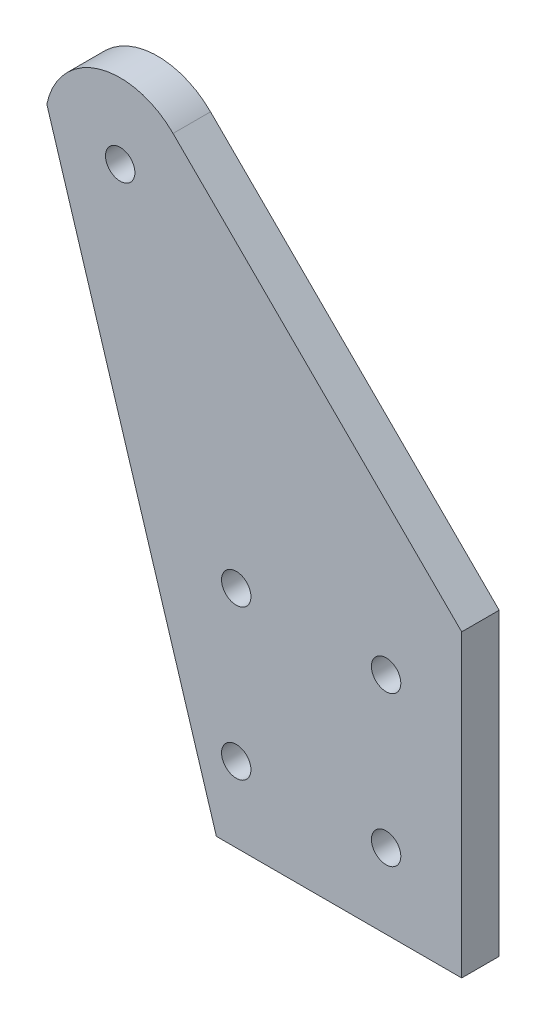
ISO-10303-21;
HEADER;
FILE_DESCRIPTION(('STEP AP214'),'2;1');
FILE_NAME('part.step','',(''),(''),'','','');
FILE_SCHEMA(('AUTOMOTIVE_DESIGN { 1 0 10303 214 1 1 1 1 }'));
ENDSEC;
DATA;
#1=APPLICATION_CONTEXT('core data for automotive mechanical design processes');
#2=APPLICATION_PROTOCOL_DEFINITION('international standard','automotive_design',2000,#1);
#3=PRODUCT_CONTEXT('',#1,'mechanical');
#4=PRODUCT('Part','Part','',(#3));
#5=PRODUCT_RELATED_PRODUCT_CATEGORY('part','',(#4));
#6=PRODUCT_DEFINITION_FORMATION('','',#4);
#7=PRODUCT_DEFINITION_CONTEXT('part definition',#1,'design');
#8=PRODUCT_DEFINITION('design','',#6,#7);
#9=PRODUCT_DEFINITION_SHAPE('','',#8);
#10=(LENGTH_UNIT() NAMED_UNIT(*) SI_UNIT(.MILLI.,.METRE.));
#11=(NAMED_UNIT(*) PLANE_ANGLE_UNIT() SI_UNIT($,.RADIAN.));
#12=(NAMED_UNIT(*) SI_UNIT($,.STERADIAN.) SOLID_ANGLE_UNIT());
#13=UNCERTAINTY_MEASURE_WITH_UNIT(LENGTH_MEASURE(1.E-05),#10,'distance_accuracy_value','');
#14=(GEOMETRIC_REPRESENTATION_CONTEXT(3) GLOBAL_UNCERTAINTY_ASSIGNED_CONTEXT((#13)) GLOBAL_UNIT_ASSIGNED_CONTEXT((#10,
#11,#12)) REPRESENTATION_CONTEXT('',''));
#15=CARTESIAN_POINT('',(0.,0.,0.));
#16=DIRECTION('',(0.,0.,1.));
#17=DIRECTION('',(1.,0.,0.));
#18=AXIS2_PLACEMENT_3D('',#15,#16,#17);
#19=CARTESIAN_POINT('',(559.488248924119,155.333748981181,3.175));
#20=DIRECTION('',(0.,0.,-1.));
#21=DIRECTION('',(-1.,0.,0.));
#22=AXIS2_PLACEMENT_3D('',#19,#20,#21);
#23=CYLINDRICAL_SURFACE('',#22,12.7);
#24=CARTESIAN_POINT('',(559.488248924119,155.333748981181,-3.175));
#25=DIRECTION('',(0.,0.,1.));
#26=DIRECTION('',(1.,0.,0.));
#27=AXIS2_PLACEMENT_3D('',#24,#25,#26);
#28=CIRCLE('',#27,12.7);
#29=CARTESIAN_POINT('',(568.447904306028,164.334558691281,-3.175));
#30=VERTEX_POINT('',#29);
#31=CARTESIAN_POINT('',(547.056708923535,157.931211822858,-3.175));
#32=VERTEX_POINT('',#31);
#33=EDGE_CURVE('E148',#30,#32,#28,.T.);
#34=ORIENTED_EDGE('',*,*,#33,.T.);
#35=DIRECTION('',(0.,0.,-1.));
#36=VECTOR('',#35,1.);
#37=CARTESIAN_POINT('',(547.056708923535,157.931211822858,3.175));
#38=LINE('',#37,#36);
#39=CARTESIAN_POINT('',(547.056708923535,157.931211822858,3.175));
#40=VERTEX_POINT('',#39);
#41=EDGE_CURVE('E11',#40,#32,#38,.T.);
#42=ORIENTED_EDGE('',*,*,#41,.F.);
#43=CARTESIAN_POINT('',(559.488248924119,155.333748981181,3.175));
#44=DIRECTION('',(0.,0.,1.));
#45=DIRECTION('',(1.,0.,0.));
#46=AXIS2_PLACEMENT_3D('',#43,#44,#45);
#47=CIRCLE('',#46,12.7);
#48=CARTESIAN_POINT('',(568.447904306028,164.334558691281,3.175));
#49=VERTEX_POINT('',#48);
#50=EDGE_CURVE('E183',#49,#40,#47,.T.);
#51=ORIENTED_EDGE('',*,*,#50,.F.);
#52=DIRECTION('',(0.,0.,-1.));
#53=VECTOR('',#52,1.);
#54=CARTESIAN_POINT('',(568.447904306028,164.334558691281,3.175));
#55=LINE('',#54,#53);
#56=EDGE_CURVE('E64',#49,#30,#55,.T.);
#57=ORIENTED_EDGE('',*,*,#56,.T.);
#58=EDGE_LOOP('',(#34,#42,#51,#57));
#59=FACE_BOUND('',#58,.T.);
#60=ADVANCED_FACE('F47',(#59),#23,.T.);
#61=CARTESIAN_POINT('',(543.978434693979,167.904246073688,3.175));
#62=DIRECTION('',(0.955518802483172,0.29493019191179,0.));
#63=DIRECTION('',(-0.29493019191179,0.955518802483172,0.));
#64=AXIS2_PLACEMENT_3D('',#61,#62,#63);
#65=PLANE('',#64);
#66=DIRECTION('',(0.29493019191179,-0.955518802483172,0.));
#67=VECTOR('',#66,1.);
#68=CARTESIAN_POINT('',(543.978434693979,167.904246073688,-3.175));
#69=LINE('',#68,#67);
#70=CARTESIAN_POINT('',(575.788290011895,64.8462489811812,-3.175));
#71=VERTEX_POINT('',#70);
#72=EDGE_CURVE('E151',#32,#71,#69,.T.);
#73=ORIENTED_EDGE('',*,*,#72,.T.);
#74=DIRECTION('',(0.,0.,-1.));
#75=VECTOR('',#74,1.);
#76=CARTESIAN_POINT('',(575.788290011895,64.8462489811812,3.175));
#77=LINE('',#76,#75);
#78=CARTESIAN_POINT('',(575.788290011895,64.8462489811812,3.175));
#79=VERTEX_POINT('',#78);
#80=EDGE_CURVE('E56',#79,#71,#77,.T.);
#81=ORIENTED_EDGE('',*,*,#80,.F.);
#82=DIRECTION('',(0.29493019191179,-0.955518802483172,0.));
#83=VECTOR('',#82,1.);
#84=CARTESIAN_POINT('',(543.978434693979,167.904246073688,3.175));
#85=LINE('',#84,#83);
#86=EDGE_CURVE('E93',#40,#79,#85,.T.);
#87=ORIENTED_EDGE('',*,*,#86,.F.);
#88=ORIENTED_EDGE('',*,*,#41,.T.);
#89=EDGE_LOOP('',(#73,#81,#87,#88));
#90=FACE_BOUND('',#89,.T.);
#91=ADVANCED_FACE('F207',(#90),#65,.F.);
#92=CARTESIAN_POINT('',(0.,64.8462489811812,3.175));
#93=DIRECTION('',(0.,1.,0.));
#94=DIRECTION('',(0.,0.,1.));
#95=AXIS2_PLACEMENT_3D('',#92,#93,#94);
#96=PLANE('',#95);
#97=DIRECTION('',(1.,0.,0.));
#98=VECTOR('',#97,1.);
#99=CARTESIAN_POINT('',(0.,64.8462489811812,-3.175));
#100=LINE('',#99,#98);
#101=CARTESIAN_POINT('',(617.35985372005,64.8462489811812,-3.175));
#102=VERTEX_POINT('',#101);
#103=EDGE_CURVE('E115',#71,#102,#100,.T.);
#104=ORIENTED_EDGE('',*,*,#103,.T.);
#105=DIRECTION('',(0.,0.,-1.));
#106=VECTOR('',#105,1.);
#107=CARTESIAN_POINT('',(617.35985372005,64.8462489811812,3.175));
#108=LINE('',#107,#106);
#109=CARTESIAN_POINT('',(617.35985372005,64.8462489811812,3.175));
#110=VERTEX_POINT('',#109);
#111=EDGE_CURVE('E112',#110,#102,#108,.T.);
#112=ORIENTED_EDGE('',*,*,#111,.F.);
#113=DIRECTION('',(1.,0.,0.));
#114=VECTOR('',#113,1.);
#115=CARTESIAN_POINT('',(0.,64.8462489811812,3.175));
#116=LINE('',#115,#114);
#117=EDGE_CURVE('E100',#79,#110,#116,.T.);
#118=ORIENTED_EDGE('',*,*,#117,.F.);
#119=ORIENTED_EDGE('',*,*,#80,.T.);
#120=EDGE_LOOP('',(#104,#112,#118,#119));
#121=FACE_BOUND('',#120,.T.);
#122=ADVANCED_FACE('F113',(#121),#96,.F.);
#123=CARTESIAN_POINT('',(617.35985372005,0.,3.175));
#124=DIRECTION('',(1.,0.,0.));
#125=DIRECTION('',(0.,0.,-1.));
#126=AXIS2_PLACEMENT_3D('',#123,#124,#125);
#127=PLANE('',#126);
#128=DIRECTION('',(0.,-1.,0.));
#129=VECTOR('',#128,1.);
#130=CARTESIAN_POINT('',(617.35985372005,0.,-3.175));
#131=LINE('',#130,#129);
#132=CARTESIAN_POINT('',(617.35985372005,115.646248981181,-3.175));
#133=VERTEX_POINT('',#132);
#134=EDGE_CURVE('E156',#133,#102,#131,.T.);
#135=ORIENTED_EDGE('',*,*,#134,.F.);
#136=DIRECTION('',(0.,0.,-1.));
#137=VECTOR('',#136,1.);
#138=CARTESIAN_POINT('',(617.35985372005,115.646248981181,3.175));
#139=LINE('',#138,#137);
#140=CARTESIAN_POINT('',(617.35985372005,115.646248981181,3.175));
#141=VERTEX_POINT('',#140);
#142=EDGE_CURVE('E81',#141,#133,#139,.T.);
#143=ORIENTED_EDGE('',*,*,#142,.F.);
#144=DIRECTION('',(0.,-1.,0.));
#145=VECTOR('',#144,1.);
#146=CARTESIAN_POINT('',(617.35985372005,0.,3.175));
#147=LINE('',#146,#145);
#148=EDGE_CURVE('E106',#141,#110,#147,.T.);
#149=ORIENTED_EDGE('',*,*,#148,.T.);
#150=ORIENTED_EDGE('',*,*,#111,.T.);
#151=EDGE_LOOP('',(#135,#143,#149,#150));
#152=FACE_BOUND('',#151,.T.);
#153=ADVANCED_FACE('F120',(#152),#127,.T.);
#154=CARTESIAN_POINT('',(579.152741561414,77.5462489811812,3.175));
#155=DIRECTION('',(0.,0.,-1.));
#156=DIRECTION('',(-1.,0.,0.));
#157=AXIS2_PLACEMENT_3D('',#154,#155,#156);
#158=CYLINDRICAL_SURFACE('',#157,2.48920000000006);
#159=CARTESIAN_POINT('',(579.152741561414,77.5462489811812,3.175));
#160=DIRECTION('',(0.,0.,1.));
#161=DIRECTION('',(1.,0.,0.));
#162=AXIS2_PLACEMENT_3D('',#159,#160,#161);
#163=CIRCLE('',#162,2.48920000000006);
#164=CARTESIAN_POINT('',(581.641941561414,77.5462489811812,3.175));
#165=VERTEX_POINT('',#164);
#166=EDGE_CURVE('E140',#165,#165,#163,.T.);
#167=ORIENTED_EDGE('',*,*,#166,.T.);
#168=EDGE_LOOP('',(#167));
#169=FACE_BOUND('',#168,.T.);
#170=CARTESIAN_POINT('',(579.152741561414,77.5462489811812,-3.175));
#171=DIRECTION('',(0.,0.,1.));
#172=DIRECTION('',(1.,0.,0.));
#173=AXIS2_PLACEMENT_3D('',#170,#171,#172);
#174=CIRCLE('',#173,2.48920000000006);
#175=CARTESIAN_POINT('',(581.641941561414,77.5462489811812,-3.175));
#176=VERTEX_POINT('',#175);
#177=EDGE_CURVE('E175',#176,#176,#174,.T.);
#178=ORIENTED_EDGE('',*,*,#177,.F.);
#179=EDGE_LOOP('',(#178));
#180=FACE_BOUND('',#179,.T.);
#181=ADVANCED_FACE('F220',(#169,#180),#158,.F.);
#182=CARTESIAN_POINT('',(604.552741561414,77.5462489811812,3.175));
#183=DIRECTION('',(0.,0.,-1.));
#184=DIRECTION('',(-1.,0.,0.));
#185=AXIS2_PLACEMENT_3D('',#182,#183,#184);
#186=CYLINDRICAL_SURFACE('',#185,2.48920000000006);
#187=CARTESIAN_POINT('',(604.552741561414,77.5462489811812,3.175));
#188=DIRECTION('',(0.,0.,1.));
#189=DIRECTION('',(1.,0.,0.));
#190=AXIS2_PLACEMENT_3D('',#187,#188,#189);
#191=CIRCLE('',#190,2.48920000000006);
#192=CARTESIAN_POINT('',(607.041941561414,77.5462489811812,3.175));
#193=VERTEX_POINT('',#192);
#194=EDGE_CURVE('E136',#193,#193,#191,.T.);
#195=ORIENTED_EDGE('',*,*,#194,.T.);
#196=EDGE_LOOP('',(#195));
#197=FACE_BOUND('',#196,.T.);
#198=CARTESIAN_POINT('',(604.552741561414,77.5462489811812,-3.175));
#199=DIRECTION('',(0.,0.,1.));
#200=DIRECTION('',(1.,0.,0.));
#201=AXIS2_PLACEMENT_3D('',#198,#199,#200);
#202=CIRCLE('',#201,2.48920000000006);
#203=CARTESIAN_POINT('',(607.041941561414,77.5462489811812,-3.175));
#204=VERTEX_POINT('',#203);
#205=EDGE_CURVE('E171',#204,#204,#202,.T.);
#206=ORIENTED_EDGE('',*,*,#205,.F.);
#207=EDGE_LOOP('',(#206));
#208=FACE_BOUND('',#207,.T.);
#209=ADVANCED_FACE('F224',(#197,#208),#186,.F.);
#210=CARTESIAN_POINT('',(604.552741561414,102.946248981181,3.175));
#211=DIRECTION('',(0.,0.,-1.));
#212=DIRECTION('',(-1.,0.,0.));
#213=AXIS2_PLACEMENT_3D('',#210,#211,#212);
#214=CYLINDRICAL_SURFACE('',#213,2.48920000000006);
#215=CARTESIAN_POINT('',(604.552741561414,102.946248981181,3.175));
#216=DIRECTION('',(0.,0.,1.));
#217=DIRECTION('',(1.,0.,0.));
#218=AXIS2_PLACEMENT_3D('',#215,#216,#217);
#219=CIRCLE('',#218,2.48920000000006);
#220=CARTESIAN_POINT('',(607.041941561414,102.946248981181,3.175));
#221=VERTEX_POINT('',#220);
#222=EDGE_CURVE('E132',#221,#221,#219,.T.);
#223=ORIENTED_EDGE('',*,*,#222,.T.);
#224=EDGE_LOOP('',(#223));
#225=FACE_BOUND('',#224,.T.);
#226=CARTESIAN_POINT('',(604.552741561414,102.946248981181,-3.175));
#227=DIRECTION('',(0.,0.,1.));
#228=DIRECTION('',(1.,0.,0.));
#229=AXIS2_PLACEMENT_3D('',#226,#227,#228);
#230=CIRCLE('',#229,2.48920000000006);
#231=CARTESIAN_POINT('',(607.041941561414,102.946248981181,-3.175));
#232=VERTEX_POINT('',#231);
#233=EDGE_CURVE('E167',#232,#232,#230,.T.);
#234=ORIENTED_EDGE('',*,*,#233,.F.);
#235=EDGE_LOOP('',(#234));
#236=FACE_BOUND('',#235,.T.);
#237=ADVANCED_FACE('F202',(#225,#236),#214,.F.);
#238=CARTESIAN_POINT('',(579.152741561414,102.946248981181,3.175));
#239=DIRECTION('',(0.,0.,-1.));
#240=DIRECTION('',(-1.,0.,0.));
#241=AXIS2_PLACEMENT_3D('',#238,#239,#240);
#242=CYLINDRICAL_SURFACE('',#241,2.48920000000006);
#243=CARTESIAN_POINT('',(579.152741561414,102.946248981181,3.175));
#244=DIRECTION('',(0.,0.,1.));
#245=DIRECTION('',(1.,0.,0.));
#246=AXIS2_PLACEMENT_3D('',#243,#244,#245);
#247=CIRCLE('',#246,2.48920000000006);
#248=CARTESIAN_POINT('',(581.641941561414,102.946248981181,3.175));
#249=VERTEX_POINT('',#248);
#250=EDGE_CURVE('E125',#249,#249,#247,.T.);
#251=ORIENTED_EDGE('',*,*,#250,.T.);
#252=EDGE_LOOP('',(#251));
#253=FACE_BOUND('',#252,.T.);
#254=CARTESIAN_POINT('',(579.152741561414,102.946248981181,-3.175));
#255=DIRECTION('',(0.,0.,1.));
#256=DIRECTION('',(1.,0.,0.));
#257=AXIS2_PLACEMENT_3D('',#254,#255,#256);
#258=CIRCLE('',#257,2.48920000000006);
#259=CARTESIAN_POINT('',(581.641941561414,102.946248981181,-3.175));
#260=VERTEX_POINT('',#259);
#261=EDGE_CURVE('E163',#260,#260,#258,.T.);
#262=ORIENTED_EDGE('',*,*,#261,.F.);
#263=EDGE_LOOP('',(#262));
#264=FACE_BOUND('',#263,.T.);
#265=ADVANCED_FACE('F194',(#253,#264),#242,.F.);
#266=CARTESIAN_POINT('',(365.087842895137,366.764798566363,3.175));
#267=DIRECTION('',(0.705484675740877,0.708725174023605,0.));
#268=DIRECTION('',(-0.708725174023605,0.705484675740877,0.));
#269=AXIS2_PLACEMENT_3D('',#266,#267,#268);
#270=PLANE('',#269);
#271=DIRECTION('',(0.708725174023605,-0.705484675740877,0.));
#272=VECTOR('',#271,1.);
#273=CARTESIAN_POINT('',(365.087842895137,366.764798566363,-3.175));
#274=LINE('',#273,#272);
#275=EDGE_CURVE('E159',#30,#133,#274,.T.);
#276=ORIENTED_EDGE('',*,*,#275,.F.);
#277=ORIENTED_EDGE('',*,*,#56,.F.);
#278=DIRECTION('',(0.708725174023605,-0.705484675740877,0.));
#279=VECTOR('',#278,1.);
#280=CARTESIAN_POINT('',(365.087842895137,366.764798566363,3.175));
#281=LINE('',#280,#279);
#282=EDGE_CURVE('E122',#49,#141,#281,.T.);
#283=ORIENTED_EDGE('',*,*,#282,.T.);
#284=ORIENTED_EDGE('',*,*,#142,.T.);
#285=EDGE_LOOP('',(#276,#277,#283,#284));
#286=FACE_BOUND('',#285,.T.);
#287=ADVANCED_FACE('F191',(#286),#270,.T.);
#288=CARTESIAN_POINT('',(559.488248924119,155.333748981181,3.175));
#289=DIRECTION('',(0.,0.,-1.));
#290=DIRECTION('',(-1.,0.,0.));
#291=AXIS2_PLACEMENT_3D('',#288,#289,#290);
#292=CYLINDRICAL_SURFACE('',#291,2.48919999999995);
#293=CARTESIAN_POINT('',(559.488248924119,155.333748981181,3.175));
#294=DIRECTION('',(0.,0.,1.));
#295=DIRECTION('',(1.,0.,0.));
#296=AXIS2_PLACEMENT_3D('',#293,#294,#295);
#297=CIRCLE('',#296,2.48919999999995);
#298=CARTESIAN_POINT('',(561.977448924119,155.333748981181,3.175));
#299=VERTEX_POINT('',#298);
#300=EDGE_CURVE('E144',#299,#299,#297,.T.);
#301=ORIENTED_EDGE('',*,*,#300,.T.);
#302=EDGE_LOOP('',(#301));
#303=FACE_BOUND('',#302,.T.);
#304=CARTESIAN_POINT('',(559.488248924119,155.333748981181,-3.175));
#305=DIRECTION('',(0.,0.,1.));
#306=DIRECTION('',(1.,0.,0.));
#307=AXIS2_PLACEMENT_3D('',#304,#305,#306);
#308=CIRCLE('',#307,2.48919999999995);
#309=CARTESIAN_POINT('',(561.977448924119,155.333748981181,-3.175));
#310=VERTEX_POINT('',#309);
#311=EDGE_CURVE('E179',#310,#310,#308,.T.);
#312=ORIENTED_EDGE('',*,*,#311,.F.);
#313=EDGE_LOOP('',(#312));
#314=FACE_BOUND('',#313,.T.);
#315=ADVANCED_FACE('F193',(#303,#314),#292,.F.);
#316=CARTESIAN_POINT('',(0.,0.,3.175));
#317=DIRECTION('',(0.,0.,1.));
#318=DIRECTION('',(1.,0.,0.));
#319=AXIS2_PLACEMENT_3D('',#316,#317,#318);
#320=PLANE('',#319);
#321=ORIENTED_EDGE('',*,*,#50,.T.);
#322=ORIENTED_EDGE('',*,*,#86,.T.);
#323=ORIENTED_EDGE('',*,*,#117,.T.);
#324=ORIENTED_EDGE('',*,*,#148,.F.);
#325=ORIENTED_EDGE('',*,*,#282,.F.);
#326=EDGE_LOOP('',(#321,#322,#323,#324,#325));
#327=FACE_BOUND('',#326,.T.);
#328=ORIENTED_EDGE('',*,*,#250,.F.);
#329=EDGE_LOOP('',(#328));
#330=FACE_BOUND('',#329,.T.);
#331=ORIENTED_EDGE('',*,*,#222,.F.);
#332=EDGE_LOOP('',(#331));
#333=FACE_BOUND('',#332,.T.);
#334=ORIENTED_EDGE('',*,*,#194,.F.);
#335=EDGE_LOOP('',(#334));
#336=FACE_BOUND('',#335,.T.);
#337=ORIENTED_EDGE('',*,*,#166,.F.);
#338=EDGE_LOOP('',(#337));
#339=FACE_BOUND('',#338,.T.);
#340=ORIENTED_EDGE('',*,*,#300,.F.);
#341=EDGE_LOOP('',(#340));
#342=FACE_BOUND('',#341,.T.);
#343=ADVANCED_FACE('F102',(#327,#330,#333,#336,#339,#342),#320,.T.);
#344=CARTESIAN_POINT('',(0.,0.,-3.175));
#345=DIRECTION('',(0.,0.,1.));
#346=DIRECTION('',(1.,0.,0.));
#347=AXIS2_PLACEMENT_3D('',#344,#345,#346);
#348=PLANE('',#347);
#349=ORIENTED_EDGE('',*,*,#33,.F.);
#350=ORIENTED_EDGE('',*,*,#275,.T.);
#351=ORIENTED_EDGE('',*,*,#134,.T.);
#352=ORIENTED_EDGE('',*,*,#103,.F.);
#353=ORIENTED_EDGE('',*,*,#72,.F.);
#354=EDGE_LOOP('',(#349,#350,#351,#352,#353));
#355=FACE_BOUND('',#354,.T.);
#356=ORIENTED_EDGE('',*,*,#261,.T.);
#357=EDGE_LOOP('',(#356));
#358=FACE_BOUND('',#357,.T.);
#359=ORIENTED_EDGE('',*,*,#233,.T.);
#360=EDGE_LOOP('',(#359));
#361=FACE_BOUND('',#360,.T.);
#362=ORIENTED_EDGE('',*,*,#205,.T.);
#363=EDGE_LOOP('',(#362));
#364=FACE_BOUND('',#363,.T.);
#365=ORIENTED_EDGE('',*,*,#177,.T.);
#366=EDGE_LOOP('',(#365));
#367=FACE_BOUND('',#366,.T.);
#368=ORIENTED_EDGE('',*,*,#311,.T.);
#369=EDGE_LOOP('',(#368));
#370=FACE_BOUND('',#369,.T.);
#371=ADVANCED_FACE('F189',(#355,#358,#361,#364,#367,#370),#348,.F.);
#372=CLOSED_SHELL('',(#60,#91,#122,#153,#181,#209,#237,#265,#287,#315,#343,#371));
#373=MANIFOLD_SOLID_BREP('B2',#372);
#374=ADVANCED_BREP_SHAPE_REPRESENTATION('',(#18,#373),#14);
#375=SHAPE_DEFINITION_REPRESENTATION(#9,#374);
ENDSEC;
END-ISO-10303-21;
